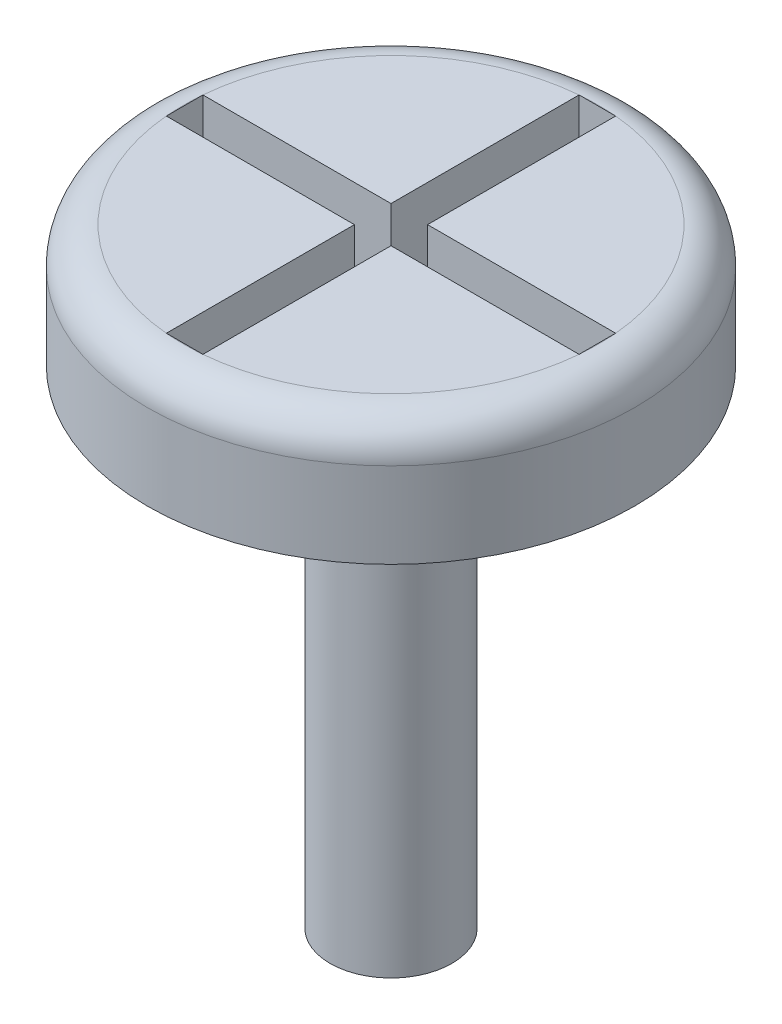
ISO-10303-21;
HEADER;
FILE_DESCRIPTION(('STEP AP214'),'2;1');
FILE_NAME('part.step','',(''),(''),'','','');
FILE_SCHEMA(('AUTOMOTIVE_DESIGN { 1 0 10303 214 1 1 1 1 }'));
ENDSEC;
DATA;
#1=APPLICATION_CONTEXT('core data for automotive mechanical design processes');
#2=APPLICATION_PROTOCOL_DEFINITION('international standard','automotive_design',2000,#1);
#3=PRODUCT_CONTEXT('',#1,'mechanical');
#4=PRODUCT('Part','Part','',(#3));
#5=PRODUCT_RELATED_PRODUCT_CATEGORY('part','',(#4));
#6=PRODUCT_DEFINITION_FORMATION('','',#4);
#7=PRODUCT_DEFINITION_CONTEXT('part definition',#1,'design');
#8=PRODUCT_DEFINITION('design','',#6,#7);
#9=PRODUCT_DEFINITION_SHAPE('','',#8);
#10=(LENGTH_UNIT() NAMED_UNIT(*) SI_UNIT(.MILLI.,.METRE.));
#11=(NAMED_UNIT(*) PLANE_ANGLE_UNIT() SI_UNIT($,.RADIAN.));
#12=(NAMED_UNIT(*) SI_UNIT($,.STERADIAN.) SOLID_ANGLE_UNIT());
#13=UNCERTAINTY_MEASURE_WITH_UNIT(LENGTH_MEASURE(1.E-05),#10,'distance_accuracy_value','');
#14=(GEOMETRIC_REPRESENTATION_CONTEXT(3) GLOBAL_UNCERTAINTY_ASSIGNED_CONTEXT((#13)) GLOBAL_UNIT_ASSIGNED_CONTEXT((#10,
#11,#12)) REPRESENTATION_CONTEXT('',''));
#15=CARTESIAN_POINT('',(0.,0.,0.));
#16=DIRECTION('',(0.,0.,1.));
#17=DIRECTION('',(1.,0.,0.));
#18=AXIS2_PLACEMENT_3D('',#15,#16,#17);
#19=CARTESIAN_POINT('',(0.,5.,0.));
#20=DIRECTION('',(0.,1.,0.));
#21=DIRECTION('',(0.,0.,1.));
#22=AXIS2_PLACEMENT_3D('',#19,#20,#21);
#23=PLANE('',#22);
#24=DIRECTION('',(-1.,0.,0.));
#25=VECTOR('',#24,1.);
#26=CARTESIAN_POINT('',(0.150000000000001,5.,-0.15));
#27=LINE('',#26,#25);
#28=CARTESIAN_POINT('',(1.69336942218761,5.,-0.15));
#29=VERTEX_POINT('',#28);
#30=CARTESIAN_POINT('',(0.150000000000001,5.,-0.15));
#31=VERTEX_POINT('',#30);
#32=EDGE_CURVE('E47',#29,#31,#27,.T.);
#33=ORIENTED_EDGE('',*,*,#32,.F.);
#34=CARTESIAN_POINT('',(0.,5.,0.));
#35=DIRECTION('',(0.,1.,0.));
#36=DIRECTION('',(0.,0.,1.));
#37=AXIS2_PLACEMENT_3D('',#34,#35,#36);
#38=CIRCLE('',#37,1.7);
#39=CARTESIAN_POINT('',(0.15,5.,-1.69336942218761));
#40=VERTEX_POINT('',#39);
#41=EDGE_CURVE('E219',#29,#40,#38,.T.);
#42=ORIENTED_EDGE('',*,*,#41,.T.);
#43=DIRECTION('',(0.,0.,-1.));
#44=VECTOR('',#43,1.);
#45=CARTESIAN_POINT('',(0.150000000000001,5.,-0.15));
#46=LINE('',#45,#44);
#47=EDGE_CURVE('E157',#31,#40,#46,.T.);
#48=ORIENTED_EDGE('',*,*,#47,.F.);
#49=EDGE_LOOP('',(#33,#42,#48));
#50=FACE_BOUND('',#49,.T.);
#51=ADVANCED_FACE('F32',(#50),#23,.T.);
#52=DIRECTION('',(0.,0.,-1.));
#53=VECTOR('',#52,1.);
#54=CARTESIAN_POINT('',(1.69336942218761,5.,0.15));
#55=LINE('',#54,#53);
#56=CARTESIAN_POINT('',(1.69336942218761,5.,0.15));
#57=VERTEX_POINT('',#56);
#58=EDGE_CURVE('E184',#57,#29,#55,.T.);
#59=ORIENTED_EDGE('',*,*,#58,.F.);
#60=EDGE_CURVE('E215',#57,#29,#38,.T.);
#61=ORIENTED_EDGE('',*,*,#60,.T.);
#62=EDGE_LOOP('',(#59,#61));
#63=FACE_BOUND('',#62,.T.);
#64=ADVANCED_FACE('F254',(#63),#23,.T.);
#65=DIRECTION('',(1.,0.,0.));
#66=VECTOR('',#65,1.);
#67=CARTESIAN_POINT('',(0.15,5.,0.15));
#68=LINE('',#67,#66);
#69=CARTESIAN_POINT('',(0.15,5.,0.15));
#70=VERTEX_POINT('',#69);
#71=EDGE_CURVE('E182',#70,#57,#68,.T.);
#72=ORIENTED_EDGE('',*,*,#71,.F.);
#73=DIRECTION('',(0.,0.,-1.));
#74=VECTOR('',#73,1.);
#75=CARTESIAN_POINT('',(0.15,5.,1.69336942218761));
#76=LINE('',#75,#74);
#77=CARTESIAN_POINT('',(0.15,5.,1.69336942218761));
#78=VERTEX_POINT('',#77);
#79=EDGE_CURVE('E131',#78,#70,#76,.T.);
#80=ORIENTED_EDGE('',*,*,#79,.F.);
#81=EDGE_CURVE('E40',#78,#57,#38,.T.);
#82=ORIENTED_EDGE('',*,*,#81,.T.);
#83=EDGE_LOOP('',(#72,#80,#82));
#84=FACE_BOUND('',#83,.T.);
#85=ADVANCED_FACE('F256',(#84),#23,.T.);
#86=DIRECTION('',(1.,0.,0.));
#87=VECTOR('',#86,1.);
#88=CARTESIAN_POINT('',(-0.15,5.,1.69336942218761));
#89=LINE('',#88,#87);
#90=CARTESIAN_POINT('',(-0.15,5.,1.69336942218761));
#91=VERTEX_POINT('',#90);
#92=EDGE_CURVE('E178',#91,#78,#89,.T.);
#93=ORIENTED_EDGE('',*,*,#92,.F.);
#94=EDGE_CURVE('E213',#91,#78,#38,.T.);
#95=ORIENTED_EDGE('',*,*,#94,.T.);
#96=EDGE_LOOP('',(#93,#95));
#97=FACE_BOUND('',#96,.T.);
#98=ADVANCED_FACE('F258',(#97),#23,.T.);
#99=DIRECTION('',(0.,0.,1.));
#100=VECTOR('',#99,1.);
#101=CARTESIAN_POINT('',(-0.15,5.,1.69336942218761));
#102=LINE('',#101,#100);
#103=CARTESIAN_POINT('',(-0.15,5.,0.15));
#104=VERTEX_POINT('',#103);
#105=EDGE_CURVE('E175',#104,#91,#102,.T.);
#106=ORIENTED_EDGE('',*,*,#105,.F.);
#107=DIRECTION('',(1.,0.,0.));
#108=VECTOR('',#107,1.);
#109=CARTESIAN_POINT('',(-1.69336942218761,5.,0.15));
#110=LINE('',#109,#108);
#111=CARTESIAN_POINT('',(-1.69336942218761,5.,0.15));
#112=VERTEX_POINT('',#111);
#113=EDGE_CURVE('E172',#112,#104,#110,.T.);
#114=ORIENTED_EDGE('',*,*,#113,.F.);
#115=EDGE_CURVE('E221',#112,#91,#38,.T.);
#116=ORIENTED_EDGE('',*,*,#115,.T.);
#117=EDGE_LOOP('',(#106,#114,#116));
#118=FACE_BOUND('',#117,.T.);
#119=ADVANCED_FACE('F264',(#118),#23,.T.);
#120=DIRECTION('',(0.,0.,1.));
#121=VECTOR('',#120,1.);
#122=CARTESIAN_POINT('',(-1.69336942218761,5.,0.15));
#123=LINE('',#122,#121);
#124=CARTESIAN_POINT('',(-1.69336942218761,5.,-0.15));
#125=VERTEX_POINT('',#124);
#126=EDGE_CURVE('E169',#125,#112,#123,.T.);
#127=ORIENTED_EDGE('',*,*,#126,.F.);
#128=EDGE_CURVE('E226',#125,#112,#38,.T.);
#129=ORIENTED_EDGE('',*,*,#128,.T.);
#130=EDGE_LOOP('',(#127,#129));
#131=FACE_BOUND('',#130,.T.);
#132=ADVANCED_FACE('F285',(#131),#23,.T.);
#133=DIRECTION('',(-1.,0.,0.));
#134=VECTOR('',#133,1.);
#135=CARTESIAN_POINT('',(-1.69336942218761,5.,-0.15));
#136=LINE('',#135,#134);
#137=CARTESIAN_POINT('',(-0.15,5.,-0.15));
#138=VERTEX_POINT('',#137);
#139=EDGE_CURVE('E166',#138,#125,#136,.T.);
#140=ORIENTED_EDGE('',*,*,#139,.F.);
#141=DIRECTION('',(0.,0.,1.));
#142=VECTOR('',#141,1.);
#143=CARTESIAN_POINT('',(-0.15,5.,-0.15));
#144=LINE('',#143,#142);
#145=CARTESIAN_POINT('',(-0.15,5.,-1.69336942218761));
#146=VERTEX_POINT('',#145);
#147=EDGE_CURVE('E163',#146,#138,#144,.T.);
#148=ORIENTED_EDGE('',*,*,#147,.F.);
#149=EDGE_CURVE('E232',#146,#125,#38,.T.);
#150=ORIENTED_EDGE('',*,*,#149,.T.);
#151=EDGE_LOOP('',(#140,#148,#150));
#152=FACE_BOUND('',#151,.T.);
#153=ADVANCED_FACE('F273',(#152),#23,.T.);
#154=CARTESIAN_POINT('',(0.,5.,0.));
#155=DIRECTION('',(0.,-1.,0.));
#156=DIRECTION('',(0.,0.,-1.));
#157=AXIS2_PLACEMENT_3D('',#154,#155,#156);
#158=CYLINDRICAL_SURFACE('',#157,0.5);
#159=CARTESIAN_POINT('',(0.,0.,0.));
#160=DIRECTION('',(0.,1.,0.));
#161=DIRECTION('',(0.,0.,1.));
#162=AXIS2_PLACEMENT_3D('',#159,#160,#161);
#163=CIRCLE('',#162,0.5);
#164=CARTESIAN_POINT('',(0.,0.,0.5));
#165=VERTEX_POINT('',#164);
#166=EDGE_CURVE('E208',#165,#165,#163,.T.);
#167=ORIENTED_EDGE('',*,*,#166,.T.);
#168=EDGE_LOOP('',(#167));
#169=FACE_BOUND('',#168,.T.);
#170=CARTESIAN_POINT('',(0.,4.,0.));
#171=DIRECTION('',(0.,1.,0.));
#172=DIRECTION('',(0.,0.,1.));
#173=AXIS2_PLACEMENT_3D('',#170,#171,#172);
#174=CIRCLE('',#173,0.5);
#175=CARTESIAN_POINT('',(0.,4.,0.5));
#176=VERTEX_POINT('',#175);
#177=EDGE_CURVE('E211',#176,#176,#174,.T.);
#178=ORIENTED_EDGE('',*,*,#177,.F.);
#179=EDGE_LOOP('',(#178));
#180=FACE_BOUND('',#179,.T.);
#181=ADVANCED_FACE('F284',(#169,#180),#158,.T.);
#182=CARTESIAN_POINT('',(0.,0.,0.));
#183=DIRECTION('',(0.,1.,0.));
#184=DIRECTION('',(0.,0.,1.));
#185=AXIS2_PLACEMENT_3D('',#182,#183,#184);
#186=PLANE('',#185);
#187=ORIENTED_EDGE('',*,*,#166,.F.);
#188=EDGE_LOOP('',(#187));
#189=FACE_BOUND('',#188,.T.);
#190=ADVANCED_FACE('F290',(#189),#186,.F.);
#191=CARTESIAN_POINT('',(0.,4.,0.));
#192=DIRECTION('',(0.,1.,0.));
#193=DIRECTION('',(0.,0.,1.));
#194=AXIS2_PLACEMENT_3D('',#191,#192,#193);
#195=CYLINDRICAL_SURFACE('',#194,2.);
#196=CARTESIAN_POINT('',(0.,4.7,0.));
#197=DIRECTION('',(0.,1.,0.));
#198=DIRECTION('',(0.,0.,1.));
#199=AXIS2_PLACEMENT_3D('',#196,#197,#198);
#200=CIRCLE('',#199,2.);
#201=CARTESIAN_POINT('',(0.,4.7,2.));
#202=VERTEX_POINT('',#201);
#203=EDGE_CURVE('E11',#202,#202,#200,.F.);
#204=ORIENTED_EDGE('',*,*,#203,.T.);
#205=EDGE_LOOP('',(#204));
#206=FACE_BOUND('',#205,.T.);
#207=CARTESIAN_POINT('',(0.,4.,0.));
#208=DIRECTION('',(0.,1.,0.));
#209=DIRECTION('',(0.,0.,1.));
#210=AXIS2_PLACEMENT_3D('',#207,#208,#209);
#211=CIRCLE('',#210,2.);
#212=CARTESIAN_POINT('',(0.,4.,2.));
#213=VERTEX_POINT('',#212);
#214=EDGE_CURVE('E188',#213,#213,#211,.T.);
#215=ORIENTED_EDGE('',*,*,#214,.T.);
#216=EDGE_LOOP('',(#215));
#217=FACE_BOUND('',#216,.T.);
#218=ADVANCED_FACE('F280',(#206,#217),#195,.T.);
#219=CARTESIAN_POINT('',(0.,4.,0.));
#220=DIRECTION('',(0.,1.,0.));
#221=DIRECTION('',(0.,0.,1.));
#222=AXIS2_PLACEMENT_3D('',#219,#220,#221);
#223=PLANE('',#222);
#224=ORIENTED_EDGE('',*,*,#177,.T.);
#225=EDGE_LOOP('',(#224));
#226=FACE_BOUND('',#225,.T.);
#227=ORIENTED_EDGE('',*,*,#214,.F.);
#228=EDGE_LOOP('',(#227));
#229=FACE_BOUND('',#228,.T.);
#230=ADVANCED_FACE('F272',(#226,#229),#223,.F.);
#231=DIRECTION('',(-1.,0.,0.));
#232=VECTOR('',#231,1.);
#233=CARTESIAN_POINT('',(-0.15,5.,-1.69336942218761));
#234=LINE('',#233,#232);
#235=EDGE_CURVE('E160',#40,#146,#234,.T.);
#236=ORIENTED_EDGE('',*,*,#235,.F.);
#237=EDGE_CURVE('E237',#40,#146,#38,.T.);
#238=ORIENTED_EDGE('',*,*,#237,.T.);
#239=EDGE_LOOP('',(#236,#238));
#240=FACE_BOUND('',#239,.T.);
#241=ADVANCED_FACE('F265',(#240),#23,.T.);
#242=CARTESIAN_POINT('',(0.,4.7,0.));
#243=DIRECTION('',(0.,1.,0.));
#244=DIRECTION('',(0.,0.,1.));
#245=AXIS2_PLACEMENT_3D('',#242,#243,#244);
#246=TOROIDAL_SURFACE('',#245,1.7,0.3);
#247=ORIENTED_EDGE('',*,*,#203,.F.);
#248=EDGE_LOOP('',(#247));
#249=FACE_BOUND('',#248,.T.);
#250=ORIENTED_EDGE('',*,*,#81,.F.);
#251=ORIENTED_EDGE('',*,*,#94,.F.);
#252=ORIENTED_EDGE('',*,*,#115,.F.);
#253=ORIENTED_EDGE('',*,*,#128,.F.);
#254=ORIENTED_EDGE('',*,*,#149,.F.);
#255=ORIENTED_EDGE('',*,*,#237,.F.);
#256=ORIENTED_EDGE('',*,*,#41,.F.);
#257=ORIENTED_EDGE('',*,*,#60,.F.);
#258=EDGE_LOOP('',(#250,#251,#252,#253,#254,#255,#256,#257));
#259=FACE_BOUND('',#258,.T.);
#260=ADVANCED_FACE('F34',(#249,#259),#246,.T.);
#261=CARTESIAN_POINT('',(0.150000000000001,4.4,-0.15));
#262=DIRECTION('',(0.,0.,-1.));
#263=DIRECTION('',(-1.,0.,0.));
#264=AXIS2_PLACEMENT_3D('',#261,#262,#263);
#265=PLANE('',#264);
#266=ORIENTED_EDGE('',*,*,#32,.T.);
#267=DIRECTION('',(0.,1.,0.));
#268=VECTOR('',#267,1.);
#269=CARTESIAN_POINT('',(0.150000000000001,4.4,-0.15));
#270=LINE('',#269,#268);
#271=CARTESIAN_POINT('',(0.150000000000001,4.4,-0.15));
#272=VERTEX_POINT('',#271);
#273=EDGE_CURVE('E95',#272,#31,#270,.T.);
#274=ORIENTED_EDGE('',*,*,#273,.F.);
#275=DIRECTION('',(-1.,0.,0.));
#276=VECTOR('',#275,1.);
#277=CARTESIAN_POINT('',(0.150000000000001,4.4,-0.15));
#278=LINE('',#277,#276);
#279=CARTESIAN_POINT('',(1.69336942218761,4.4,-0.15));
#280=VERTEX_POINT('',#279);
#281=EDGE_CURVE('E186',#280,#272,#278,.T.);
#282=ORIENTED_EDGE('',*,*,#281,.F.);
#283=DIRECTION('',(0.,1.,0.));
#284=VECTOR('',#283,1.);
#285=CARTESIAN_POINT('',(1.69336942218761,4.4,-0.15));
#286=LINE('',#285,#284);
#287=EDGE_CURVE('E55',#280,#29,#286,.T.);
#288=ORIENTED_EDGE('',*,*,#287,.T.);
#289=EDGE_LOOP('',(#266,#274,#282,#288));
#290=FACE_BOUND('',#289,.T.);
#291=ADVANCED_FACE('F278',(#290),#265,.F.);
#292=CARTESIAN_POINT('',(1.69336942218761,4.4,0.15));
#293=DIRECTION('',(1.,0.,0.));
#294=DIRECTION('',(0.,0.,-1.));
#295=AXIS2_PLACEMENT_3D('',#292,#293,#294);
#296=PLANE('',#295);
#297=ORIENTED_EDGE('',*,*,#58,.T.);
#298=ORIENTED_EDGE('',*,*,#287,.F.);
#299=DIRECTION('',(0.,0.,-1.));
#300=VECTOR('',#299,1.);
#301=CARTESIAN_POINT('',(1.69336942218761,4.4,0.15));
#302=LINE('',#301,#300);
#303=CARTESIAN_POINT('',(1.69336942218761,4.4,0.15));
#304=VERTEX_POINT('',#303);
#305=EDGE_CURVE('E143',#304,#280,#302,.T.);
#306=ORIENTED_EDGE('',*,*,#305,.F.);
#307=DIRECTION('',(0.,1.,0.));
#308=VECTOR('',#307,1.);
#309=CARTESIAN_POINT('',(1.69336942218761,4.4,0.15));
#310=LINE('',#309,#308);
#311=EDGE_CURVE('E135',#304,#57,#310,.T.);
#312=ORIENTED_EDGE('',*,*,#311,.T.);
#313=EDGE_LOOP('',(#297,#298,#306,#312));
#314=FACE_BOUND('',#313,.T.);
#315=ADVANCED_FACE('F255',(#314),#296,.F.);
#316=CARTESIAN_POINT('',(0.15,4.4,0.15));
#317=DIRECTION('',(0.,0.,1.));
#318=DIRECTION('',(1.,0.,0.));
#319=AXIS2_PLACEMENT_3D('',#316,#317,#318);
#320=PLANE('',#319);
#321=ORIENTED_EDGE('',*,*,#71,.T.);
#322=ORIENTED_EDGE('',*,*,#311,.F.);
#323=DIRECTION('',(1.,0.,0.));
#324=VECTOR('',#323,1.);
#325=CARTESIAN_POINT('',(0.15,4.4,0.15));
#326=LINE('',#325,#324);
#327=CARTESIAN_POINT('',(0.15,4.4,0.15));
#328=VERTEX_POINT('',#327);
#329=EDGE_CURVE('E139',#328,#304,#326,.T.);
#330=ORIENTED_EDGE('',*,*,#329,.F.);
#331=DIRECTION('',(0.,1.,0.));
#332=VECTOR('',#331,1.);
#333=CARTESIAN_POINT('',(0.15,4.4,0.15));
#334=LINE('',#333,#332);
#335=EDGE_CURVE('E124',#328,#70,#334,.T.);
#336=ORIENTED_EDGE('',*,*,#335,.T.);
#337=EDGE_LOOP('',(#321,#322,#330,#336));
#338=FACE_BOUND('',#337,.T.);
#339=ADVANCED_FACE('F140',(#338),#320,.F.);
#340=CARTESIAN_POINT('',(0.15,4.4,1.69336942218761));
#341=DIRECTION('',(1.,0.,0.));
#342=DIRECTION('',(0.,0.,-1.));
#343=AXIS2_PLACEMENT_3D('',#340,#341,#342);
#344=PLANE('',#343);
#345=ORIENTED_EDGE('',*,*,#79,.T.);
#346=ORIENTED_EDGE('',*,*,#335,.F.);
#347=DIRECTION('',(0.,0.,-1.));
#348=VECTOR('',#347,1.);
#349=CARTESIAN_POINT('',(0.15,4.4,1.69336942218761));
#350=LINE('',#349,#348);
#351=CARTESIAN_POINT('',(0.15,4.4,1.69336942218761));
#352=VERTEX_POINT('',#351);
#353=EDGE_CURVE('E128',#352,#328,#350,.T.);
#354=ORIENTED_EDGE('',*,*,#353,.F.);
#355=DIRECTION('',(0.,1.,0.));
#356=VECTOR('',#355,1.);
#357=CARTESIAN_POINT('',(0.15,4.4,1.69336942218761));
#358=LINE('',#357,#356);
#359=EDGE_CURVE('E136',#352,#78,#358,.T.);
#360=ORIENTED_EDGE('',*,*,#359,.T.);
#361=EDGE_LOOP('',(#345,#346,#354,#360));
#362=FACE_BOUND('',#361,.T.);
#363=ADVANCED_FACE('F126',(#362),#344,.F.);
#364=CARTESIAN_POINT('',(-0.15,4.4,1.69336942218761));
#365=DIRECTION('',(0.,0.,1.));
#366=DIRECTION('',(1.,0.,0.));
#367=AXIS2_PLACEMENT_3D('',#364,#365,#366);
#368=PLANE('',#367);
#369=ORIENTED_EDGE('',*,*,#92,.T.);
#370=ORIENTED_EDGE('',*,*,#359,.F.);
#371=DIRECTION('',(1.,0.,0.));
#372=VECTOR('',#371,1.);
#373=CARTESIAN_POINT('',(-0.15,4.4,1.69336942218761));
#374=LINE('',#373,#372);
#375=CARTESIAN_POINT('',(-0.15,4.4,1.69336942218761));
#376=VERTEX_POINT('',#375);
#377=EDGE_CURVE('E149',#376,#352,#374,.T.);
#378=ORIENTED_EDGE('',*,*,#377,.F.);
#379=DIRECTION('',(0.,1.,0.));
#380=VECTOR('',#379,1.);
#381=CARTESIAN_POINT('',(-0.15,4.4,1.69336942218761));
#382=LINE('',#381,#380);
#383=EDGE_CURVE('E191',#376,#91,#382,.T.);
#384=ORIENTED_EDGE('',*,*,#383,.T.);
#385=EDGE_LOOP('',(#369,#370,#378,#384));
#386=FACE_BOUND('',#385,.T.);
#387=ADVANCED_FACE('F317',(#386),#368,.F.);
#388=CARTESIAN_POINT('',(-0.15,4.4,1.69336942218761));
#389=DIRECTION('',(-1.,0.,0.));
#390=DIRECTION('',(0.,0.,1.));
#391=AXIS2_PLACEMENT_3D('',#388,#389,#390);
#392=PLANE('',#391);
#393=ORIENTED_EDGE('',*,*,#105,.T.);
#394=ORIENTED_EDGE('',*,*,#383,.F.);
#395=DIRECTION('',(0.,0.,1.));
#396=VECTOR('',#395,1.);
#397=CARTESIAN_POINT('',(-0.15,4.4,1.69336942218761));
#398=LINE('',#397,#396);
#399=CARTESIAN_POINT('',(-0.15,4.4,0.15));
#400=VERTEX_POINT('',#399);
#401=EDGE_CURVE('E151',#400,#376,#398,.T.);
#402=ORIENTED_EDGE('',*,*,#401,.F.);
#403=DIRECTION('',(0.,1.,0.));
#404=VECTOR('',#403,1.);
#405=CARTESIAN_POINT('',(-0.15,4.4,0.15));
#406=LINE('',#405,#404);
#407=EDGE_CURVE('E193',#400,#104,#406,.T.);
#408=ORIENTED_EDGE('',*,*,#407,.T.);
#409=EDGE_LOOP('',(#393,#394,#402,#408));
#410=FACE_BOUND('',#409,.T.);
#411=ADVANCED_FACE('F315',(#410),#392,.F.);
#412=CARTESIAN_POINT('',(-1.69336942218761,4.4,0.15));
#413=DIRECTION('',(0.,0.,1.));
#414=DIRECTION('',(1.,0.,0.));
#415=AXIS2_PLACEMENT_3D('',#412,#413,#414);
#416=PLANE('',#415);
#417=ORIENTED_EDGE('',*,*,#113,.T.);
#418=ORIENTED_EDGE('',*,*,#407,.F.);
#419=DIRECTION('',(1.,0.,0.));
#420=VECTOR('',#419,1.);
#421=CARTESIAN_POINT('',(-1.69336942218761,4.4,0.15));
#422=LINE('',#421,#420);
#423=CARTESIAN_POINT('',(-1.69336942218761,4.4,0.15));
#424=VERTEX_POINT('',#423);
#425=EDGE_CURVE('E303',#424,#400,#422,.T.);
#426=ORIENTED_EDGE('',*,*,#425,.F.);
#427=DIRECTION('',(0.,1.,0.));
#428=VECTOR('',#427,1.);
#429=CARTESIAN_POINT('',(-1.69336942218761,4.4,0.15));
#430=LINE('',#429,#428);
#431=EDGE_CURVE('E195',#424,#112,#430,.T.);
#432=ORIENTED_EDGE('',*,*,#431,.T.);
#433=EDGE_LOOP('',(#417,#418,#426,#432));
#434=FACE_BOUND('',#433,.T.);
#435=ADVANCED_FACE('F300',(#434),#416,.F.);
#436=CARTESIAN_POINT('',(-1.69336942218761,4.4,0.15));
#437=DIRECTION('',(-1.,0.,0.));
#438=DIRECTION('',(0.,0.,1.));
#439=AXIS2_PLACEMENT_3D('',#436,#437,#438);
#440=PLANE('',#439);
#441=ORIENTED_EDGE('',*,*,#126,.T.);
#442=ORIENTED_EDGE('',*,*,#431,.F.);
#443=DIRECTION('',(0.,0.,1.));
#444=VECTOR('',#443,1.);
#445=CARTESIAN_POINT('',(-1.69336942218761,4.4,0.15));
#446=LINE('',#445,#444);
#447=CARTESIAN_POINT('',(-1.69336942218761,4.4,-0.15));
#448=VERTEX_POINT('',#447);
#449=EDGE_CURVE('E305',#448,#424,#446,.T.);
#450=ORIENTED_EDGE('',*,*,#449,.F.);
#451=DIRECTION('',(0.,1.,0.));
#452=VECTOR('',#451,1.);
#453=CARTESIAN_POINT('',(-1.69336942218761,4.4,-0.15));
#454=LINE('',#453,#452);
#455=EDGE_CURVE('E197',#448,#125,#454,.T.);
#456=ORIENTED_EDGE('',*,*,#455,.T.);
#457=EDGE_LOOP('',(#441,#442,#450,#456));
#458=FACE_BOUND('',#457,.T.);
#459=ADVANCED_FACE('F297',(#458),#440,.F.);
#460=CARTESIAN_POINT('',(-1.69336942218761,4.4,-0.15));
#461=DIRECTION('',(0.,0.,-1.));
#462=DIRECTION('',(-1.,0.,0.));
#463=AXIS2_PLACEMENT_3D('',#460,#461,#462);
#464=PLANE('',#463);
#465=ORIENTED_EDGE('',*,*,#139,.T.);
#466=ORIENTED_EDGE('',*,*,#455,.F.);
#467=DIRECTION('',(-1.,0.,0.));
#468=VECTOR('',#467,1.);
#469=CARTESIAN_POINT('',(-1.69336942218761,4.4,-0.15));
#470=LINE('',#469,#468);
#471=CARTESIAN_POINT('',(-0.15,4.4,-0.15));
#472=VERTEX_POINT('',#471);
#473=EDGE_CURVE('E309',#472,#448,#470,.T.);
#474=ORIENTED_EDGE('',*,*,#473,.F.);
#475=DIRECTION('',(0.,1.,0.));
#476=VECTOR('',#475,1.);
#477=CARTESIAN_POINT('',(-0.15,4.4,-0.15));
#478=LINE('',#477,#476);
#479=EDGE_CURVE('E199',#472,#138,#478,.T.);
#480=ORIENTED_EDGE('',*,*,#479,.T.);
#481=EDGE_LOOP('',(#465,#466,#474,#480));
#482=FACE_BOUND('',#481,.T.);
#483=ADVANCED_FACE('F293',(#482),#464,.F.);
#484=CARTESIAN_POINT('',(-0.15,4.4,-0.15));
#485=DIRECTION('',(-1.,0.,0.));
#486=DIRECTION('',(0.,0.,1.));
#487=AXIS2_PLACEMENT_3D('',#484,#485,#486);
#488=PLANE('',#487);
#489=ORIENTED_EDGE('',*,*,#147,.T.);
#490=ORIENTED_EDGE('',*,*,#479,.F.);
#491=DIRECTION('',(0.,0.,1.));
#492=VECTOR('',#491,1.);
#493=CARTESIAN_POINT('',(-0.15,4.4,-0.15));
#494=LINE('',#493,#492);
#495=CARTESIAN_POINT('',(-0.15,4.4,-1.69336942218761));
#496=VERTEX_POINT('',#495);
#497=EDGE_CURVE('E311',#496,#472,#494,.T.);
#498=ORIENTED_EDGE('',*,*,#497,.F.);
#499=DIRECTION('',(0.,1.,0.));
#500=VECTOR('',#499,1.);
#501=CARTESIAN_POINT('',(-0.15,4.4,-1.69336942218761));
#502=LINE('',#501,#500);
#503=EDGE_CURVE('E201',#496,#146,#502,.T.);
#504=ORIENTED_EDGE('',*,*,#503,.T.);
#505=EDGE_LOOP('',(#489,#490,#498,#504));
#506=FACE_BOUND('',#505,.T.);
#507=ADVANCED_FACE('F334',(#506),#488,.F.);
#508=CARTESIAN_POINT('',(-0.15,4.4,-1.69336942218761));
#509=DIRECTION('',(0.,0.,-1.));
#510=DIRECTION('',(-1.,0.,0.));
#511=AXIS2_PLACEMENT_3D('',#508,#509,#510);
#512=PLANE('',#511);
#513=ORIENTED_EDGE('',*,*,#235,.T.);
#514=ORIENTED_EDGE('',*,*,#503,.F.);
#515=DIRECTION('',(-1.,0.,0.));
#516=VECTOR('',#515,1.);
#517=CARTESIAN_POINT('',(-0.15,4.4,-1.69336942218761));
#518=LINE('',#517,#516);
#519=CARTESIAN_POINT('',(0.15,4.4,-1.69336942218761));
#520=VERTEX_POINT('',#519);
#521=EDGE_CURVE('E537',#520,#496,#518,.T.);
#522=ORIENTED_EDGE('',*,*,#521,.F.);
#523=DIRECTION('',(0.,1.,0.));
#524=VECTOR('',#523,1.);
#525=CARTESIAN_POINT('',(0.15,4.4,-1.69336942218761));
#526=LINE('',#525,#524);
#527=EDGE_CURVE('E203',#520,#40,#526,.T.);
#528=ORIENTED_EDGE('',*,*,#527,.T.);
#529=EDGE_LOOP('',(#513,#514,#522,#528));
#530=FACE_BOUND('',#529,.T.);
#531=ADVANCED_FACE('F337',(#530),#512,.F.);
#532=CARTESIAN_POINT('',(0.150000000000001,4.4,-0.15));
#533=DIRECTION('',(1.,0.,0.));
#534=DIRECTION('',(0.,0.,-1.));
#535=AXIS2_PLACEMENT_3D('',#532,#533,#534);
#536=PLANE('',#535);
#537=ORIENTED_EDGE('',*,*,#47,.T.);
#538=ORIENTED_EDGE('',*,*,#527,.F.);
#539=DIRECTION('',(0.,0.,-1.));
#540=VECTOR('',#539,1.);
#541=CARTESIAN_POINT('',(0.150000000000001,4.4,-0.15));
#542=LINE('',#541,#540);
#543=EDGE_CURVE('E539',#272,#520,#542,.T.);
#544=ORIENTED_EDGE('',*,*,#543,.F.);
#545=ORIENTED_EDGE('',*,*,#273,.T.);
#546=EDGE_LOOP('',(#537,#538,#544,#545));
#547=FACE_BOUND('',#546,.T.);
#548=ADVANCED_FACE('F341',(#547),#536,.F.);
#549=CARTESIAN_POINT('',(0.,4.4,0.));
#550=DIRECTION('',(0.,1.,0.));
#551=DIRECTION('',(0.,0.,1.));
#552=AXIS2_PLACEMENT_3D('',#549,#550,#551);
#553=PLANE('',#552);
#554=ORIENTED_EDGE('',*,*,#281,.T.);
#555=ORIENTED_EDGE('',*,*,#543,.T.);
#556=ORIENTED_EDGE('',*,*,#521,.T.);
#557=ORIENTED_EDGE('',*,*,#497,.T.);
#558=ORIENTED_EDGE('',*,*,#473,.T.);
#559=ORIENTED_EDGE('',*,*,#449,.T.);
#560=ORIENTED_EDGE('',*,*,#425,.T.);
#561=ORIENTED_EDGE('',*,*,#401,.T.);
#562=ORIENTED_EDGE('',*,*,#377,.T.);
#563=ORIENTED_EDGE('',*,*,#353,.T.);
#564=ORIENTED_EDGE('',*,*,#329,.T.);
#565=ORIENTED_EDGE('',*,*,#305,.T.);
#566=EDGE_LOOP('',(#554,#555,#556,#557,#558,#559,#560,#561,#562,#563,#564,#565));
#567=FACE_BOUND('',#566,.T.);
#568=ADVANCED_FACE('F146',(#567),#553,.T.);
#569=CLOSED_SHELL('',(#51,#64,#85,#98,#119,#132,#153,#181,#190,#218,#230,#241,#260,#291,#315,
#339,#363,#387,#411,#435,#459,#483,#507,#531,#548,#568));
#570=MANIFOLD_SOLID_BREP('B2',#569);
#571=ADVANCED_BREP_SHAPE_REPRESENTATION('',(#18,#570),#14);
#572=SHAPE_DEFINITION_REPRESENTATION(#9,#571);
ENDSEC;
END-ISO-10303-21;
